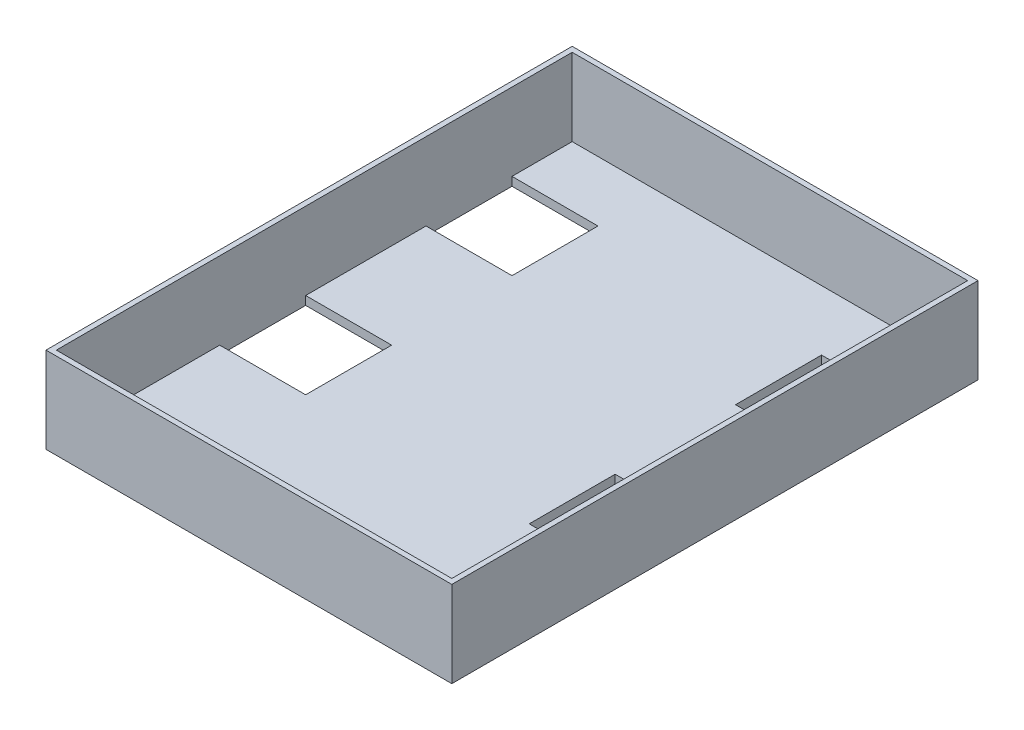
ISO-10303-21;
HEADER;
FILE_DESCRIPTION(('STEP AP214'),'2;1');
FILE_NAME('part.step','',(''),(''),'','','');
FILE_SCHEMA(('AUTOMOTIVE_DESIGN { 1 0 10303 214 1 1 1 1 }'));
ENDSEC;
DATA;
#1=APPLICATION_CONTEXT('core data for automotive mechanical design processes');
#2=APPLICATION_PROTOCOL_DEFINITION('international standard','automotive_design',2000,#1);
#3=PRODUCT_CONTEXT('',#1,'mechanical');
#4=PRODUCT('Part','Part','',(#3));
#5=PRODUCT_RELATED_PRODUCT_CATEGORY('part','',(#4));
#6=PRODUCT_DEFINITION_FORMATION('','',#4);
#7=PRODUCT_DEFINITION_CONTEXT('part definition',#1,'design');
#8=PRODUCT_DEFINITION('design','',#6,#7);
#9=PRODUCT_DEFINITION_SHAPE('','',#8);
#10=(LENGTH_UNIT() NAMED_UNIT(*) SI_UNIT(.MILLI.,.METRE.));
#11=(NAMED_UNIT(*) PLANE_ANGLE_UNIT() SI_UNIT($,.RADIAN.));
#12=(NAMED_UNIT(*) SI_UNIT($,.STERADIAN.) SOLID_ANGLE_UNIT());
#13=UNCERTAINTY_MEASURE_WITH_UNIT(LENGTH_MEASURE(1.E-05),#10,'distance_accuracy_value','');
#14=(GEOMETRIC_REPRESENTATION_CONTEXT(3) GLOBAL_UNCERTAINTY_ASSIGNED_CONTEXT((#13)) GLOBAL_UNIT_ASSIGNED_CONTEXT((#10,
#11,#12)) REPRESENTATION_CONTEXT('',''));
#15=CARTESIAN_POINT('',(0.,0.,0.));
#16=DIRECTION('',(0.,0.,1.));
#17=DIRECTION('',(1.,0.,0.));
#18=AXIS2_PLACEMENT_3D('',#15,#16,#17);
#19=CARTESIAN_POINT('',(-115.,5.,-115.));
#20=DIRECTION('',(0.,0.,-1.));
#21=DIRECTION('',(-1.,0.,0.));
#22=AXIS2_PLACEMENT_3D('',#19,#20,#21);
#23=PLANE('',#22);
#24=DIRECTION('',(1.,0.,0.));
#25=VECTOR('',#24,1.);
#26=CARTESIAN_POINT('',(-115.,0.,-115.));
#27=LINE('',#26,#25);
#28=CARTESIAN_POINT('',(-115.,0.,-115.));
#29=VERTEX_POINT('',#28);
#30=CARTESIAN_POINT('',(-65.,0.,-115.));
#31=VERTEX_POINT('',#30);
#32=EDGE_CURVE('E194',#29,#31,#27,.T.);
#33=ORIENTED_EDGE('',*,*,#32,.T.);
#34=DIRECTION('',(0.,-1.,0.));
#35=VECTOR('',#34,1.);
#36=CARTESIAN_POINT('',(-65.,5.,-115.));
#37=LINE('',#36,#35);
#38=CARTESIAN_POINT('',(-65.,5.,-115.));
#39=VERTEX_POINT('',#38);
#40=EDGE_CURVE('E48',#39,#31,#37,.T.);
#41=ORIENTED_EDGE('',*,*,#40,.F.);
#42=DIRECTION('',(1.,0.,0.));
#43=VECTOR('',#42,1.);
#44=CARTESIAN_POINT('',(-115.,5.,-115.));
#45=LINE('',#44,#43);
#46=CARTESIAN_POINT('',(-115.,5.,-115.));
#47=VERTEX_POINT('',#46);
#48=EDGE_CURVE('E116',#47,#39,#45,.T.);
#49=ORIENTED_EDGE('',*,*,#48,.F.);
#50=DIRECTION('',(0.,-1.,0.));
#51=VECTOR('',#50,1.);
#52=CARTESIAN_POINT('',(-115.,5.,-115.));
#53=LINE('',#52,#51);
#54=EDGE_CURVE('E11',#47,#29,#53,.T.);
#55=ORIENTED_EDGE('',*,*,#54,.T.);
#56=EDGE_LOOP('',(#33,#41,#49,#55));
#57=FACE_BOUND('',#56,.T.);
#58=ADVANCED_FACE('F39',(#57),#23,.F.);
#59=CARTESIAN_POINT('',(-65.,5.,-115.));
#60=DIRECTION('',(1.,0.,0.));
#61=DIRECTION('',(0.,0.,-1.));
#62=AXIS2_PLACEMENT_3D('',#59,#60,#61);
#63=PLANE('',#62);
#64=DIRECTION('',(0.,0.,1.));
#65=VECTOR('',#64,1.);
#66=CARTESIAN_POINT('',(-65.,0.,-115.));
#67=LINE('',#66,#65);
#68=CARTESIAN_POINT('',(-65.,0.,-65.));
#69=VERTEX_POINT('',#68);
#70=EDGE_CURVE('E197',#31,#69,#67,.T.);
#71=ORIENTED_EDGE('',*,*,#70,.T.);
#72=DIRECTION('',(0.,-1.,0.));
#73=VECTOR('',#72,1.);
#74=CARTESIAN_POINT('',(-65.,5.,-65.));
#75=LINE('',#74,#73);
#76=CARTESIAN_POINT('',(-65.,5.,-65.));
#77=VERTEX_POINT('',#76);
#78=EDGE_CURVE('E275',#77,#69,#75,.T.);
#79=ORIENTED_EDGE('',*,*,#78,.F.);
#80=DIRECTION('',(0.,0.,1.));
#81=VECTOR('',#80,1.);
#82=CARTESIAN_POINT('',(-65.,5.,-115.));
#83=LINE('',#82,#81);
#84=EDGE_CURVE('E285',#39,#77,#83,.T.);
#85=ORIENTED_EDGE('',*,*,#84,.F.);
#86=ORIENTED_EDGE('',*,*,#40,.T.);
#87=EDGE_LOOP('',(#71,#79,#85,#86));
#88=FACE_BOUND('',#87,.T.);
#89=ADVANCED_FACE('F283',(#88),#63,.F.);
#90=CARTESIAN_POINT('',(-65.,5.,-65.));
#91=DIRECTION('',(0.,0.,1.));
#92=DIRECTION('',(1.,0.,0.));
#93=AXIS2_PLACEMENT_3D('',#90,#91,#92);
#94=PLANE('',#93);
#95=DIRECTION('',(-1.,0.,0.));
#96=VECTOR('',#95,1.);
#97=CARTESIAN_POINT('',(-65.,0.,-65.));
#98=LINE('',#97,#96);
#99=CARTESIAN_POINT('',(-115.,0.,-65.));
#100=VERTEX_POINT('',#99);
#101=EDGE_CURVE('E201',#69,#100,#98,.T.);
#102=ORIENTED_EDGE('',*,*,#101,.T.);
#103=DIRECTION('',(0.,-1.,0.));
#104=VECTOR('',#103,1.);
#105=CARTESIAN_POINT('',(-115.,5.,-65.));
#106=LINE('',#105,#104);
#107=CARTESIAN_POINT('',(-115.,5.,-65.));
#108=VERTEX_POINT('',#107);
#109=EDGE_CURVE('E271',#108,#100,#106,.T.);
#110=ORIENTED_EDGE('',*,*,#109,.F.);
#111=DIRECTION('',(-1.,0.,0.));
#112=VECTOR('',#111,1.);
#113=CARTESIAN_POINT('',(-65.,5.,-65.));
#114=LINE('',#113,#112);
#115=EDGE_CURVE('E307',#77,#108,#114,.T.);
#116=ORIENTED_EDGE('',*,*,#115,.F.);
#117=ORIENTED_EDGE('',*,*,#78,.T.);
#118=EDGE_LOOP('',(#102,#110,#116,#117));
#119=FACE_BOUND('',#118,.T.);
#120=ADVANCED_FACE('F295',(#119),#94,.F.);
#121=CARTESIAN_POINT('',(-115.,5.,4.99999999999997));
#122=DIRECTION('',(0.,0.,-1.));
#123=DIRECTION('',(-1.,0.,0.));
#124=AXIS2_PLACEMENT_3D('',#121,#122,#123);
#125=PLANE('',#124);
#126=DIRECTION('',(1.,0.,0.));
#127=VECTOR('',#126,1.);
#128=CARTESIAN_POINT('',(-115.,0.,4.99999999999997));
#129=LINE('',#128,#127);
#130=CARTESIAN_POINT('',(-115.,0.,4.99999999999998));
#131=VERTEX_POINT('',#130);
#132=CARTESIAN_POINT('',(-65.,0.,4.99999999999997));
#133=VERTEX_POINT('',#132);
#134=EDGE_CURVE('E204',#131,#133,#129,.T.);
#135=ORIENTED_EDGE('',*,*,#134,.T.);
#136=DIRECTION('',(0.,-1.,0.));
#137=VECTOR('',#136,1.);
#138=CARTESIAN_POINT('',(-65.,5.,4.99999999999997));
#139=LINE('',#138,#137);
#140=CARTESIAN_POINT('',(-65.,5.,4.99999999999997));
#141=VERTEX_POINT('',#140);
#142=EDGE_CURVE('E263',#141,#133,#139,.T.);
#143=ORIENTED_EDGE('',*,*,#142,.F.);
#144=DIRECTION('',(1.,0.,0.));
#145=VECTOR('',#144,1.);
#146=CARTESIAN_POINT('',(-115.,5.,4.99999999999997));
#147=LINE('',#146,#145);
#148=CARTESIAN_POINT('',(-115.,5.,4.99999999999997));
#149=VERTEX_POINT('',#148);
#150=EDGE_CURVE('E306',#149,#141,#147,.T.);
#151=ORIENTED_EDGE('',*,*,#150,.F.);
#152=DIRECTION('',(0.,-1.,0.));
#153=VECTOR('',#152,1.);
#154=CARTESIAN_POINT('',(-115.,5.,4.99999999999997));
#155=LINE('',#154,#153);
#156=EDGE_CURVE('E267',#149,#131,#155,.T.);
#157=ORIENTED_EDGE('',*,*,#156,.T.);
#158=EDGE_LOOP('',(#135,#143,#151,#157));
#159=FACE_BOUND('',#158,.T.);
#160=ADVANCED_FACE('F443',(#159),#125,.F.);
#161=CARTESIAN_POINT('',(-65.,5.,4.99999999999997));
#162=DIRECTION('',(1.,0.,0.));
#163=DIRECTION('',(0.,0.,-1.));
#164=AXIS2_PLACEMENT_3D('',#161,#162,#163);
#165=PLANE('',#164);
#166=DIRECTION('',(0.,0.,1.));
#167=VECTOR('',#166,1.);
#168=CARTESIAN_POINT('',(-65.,0.,4.99999999999997));
#169=LINE('',#168,#167);
#170=CARTESIAN_POINT('',(-65.,0.,55.));
#171=VERTEX_POINT('',#170);
#172=EDGE_CURVE('E207',#133,#171,#169,.T.);
#173=ORIENTED_EDGE('',*,*,#172,.T.);
#174=DIRECTION('',(0.,-1.,0.));
#175=VECTOR('',#174,1.);
#176=CARTESIAN_POINT('',(-65.,5.,55.));
#177=LINE('',#176,#175);
#178=CARTESIAN_POINT('',(-65.,5.,55.));
#179=VERTEX_POINT('',#178);
#180=EDGE_CURVE('E259',#179,#171,#177,.T.);
#181=ORIENTED_EDGE('',*,*,#180,.F.);
#182=DIRECTION('',(0.,0.,1.));
#183=VECTOR('',#182,1.);
#184=CARTESIAN_POINT('',(-65.,5.,4.99999999999997));
#185=LINE('',#184,#183);
#186=EDGE_CURVE('E311',#141,#179,#185,.T.);
#187=ORIENTED_EDGE('',*,*,#186,.F.);
#188=ORIENTED_EDGE('',*,*,#142,.T.);
#189=EDGE_LOOP('',(#173,#181,#187,#188));
#190=FACE_BOUND('',#189,.T.);
#191=ADVANCED_FACE('F448',(#190),#165,.F.);
#192=CARTESIAN_POINT('',(-115.,5.,55.));
#193=DIRECTION('',(0.,0.,1.));
#194=DIRECTION('',(1.,0.,0.));
#195=AXIS2_PLACEMENT_3D('',#192,#193,#194);
#196=PLANE('',#195);
#197=DIRECTION('',(-1.,0.,0.));
#198=VECTOR('',#197,1.);
#199=CARTESIAN_POINT('',(-115.,0.,55.));
#200=LINE('',#199,#198);
#201=CARTESIAN_POINT('',(-115.,0.,55.));
#202=VERTEX_POINT('',#201);
#203=EDGE_CURVE('E210',#171,#202,#200,.T.);
#204=ORIENTED_EDGE('',*,*,#203,.T.);
#205=DIRECTION('',(0.,-1.,0.));
#206=VECTOR('',#205,1.);
#207=CARTESIAN_POINT('',(-115.,5.,55.));
#208=LINE('',#207,#206);
#209=CARTESIAN_POINT('',(-115.,5.,55.));
#210=VERTEX_POINT('',#209);
#211=EDGE_CURVE('E255',#210,#202,#208,.T.);
#212=ORIENTED_EDGE('',*,*,#211,.F.);
#213=DIRECTION('',(-1.,0.,0.));
#214=VECTOR('',#213,1.);
#215=CARTESIAN_POINT('',(-115.,5.,55.));
#216=LINE('',#215,#214);
#217=EDGE_CURVE('E318',#179,#210,#216,.T.);
#218=ORIENTED_EDGE('',*,*,#217,.F.);
#219=ORIENTED_EDGE('',*,*,#180,.T.);
#220=EDGE_LOOP('',(#204,#212,#218,#219));
#221=FACE_BOUND('',#220,.T.);
#222=ADVANCED_FACE('F452',(#221),#196,.F.);
#223=CARTESIAN_POINT('',(115.,5.,55.));
#224=DIRECTION('',(0.,0.,1.));
#225=DIRECTION('',(1.,0.,0.));
#226=AXIS2_PLACEMENT_3D('',#223,#224,#225);
#227=PLANE('',#226);
#228=DIRECTION('',(-1.,0.,0.));
#229=VECTOR('',#228,1.);
#230=CARTESIAN_POINT('',(115.,0.,55.));
#231=LINE('',#230,#229);
#232=CARTESIAN_POINT('',(115.,0.,55.));
#233=VERTEX_POINT('',#232);
#234=CARTESIAN_POINT('',(64.9999999999999,0.,55.));
#235=VERTEX_POINT('',#234);
#236=EDGE_CURVE('E213',#233,#235,#231,.T.);
#237=ORIENTED_EDGE('',*,*,#236,.T.);
#238=DIRECTION('',(0.,-1.,0.));
#239=VECTOR('',#238,1.);
#240=CARTESIAN_POINT('',(64.9999999999999,5.,55.));
#241=LINE('',#240,#239);
#242=CARTESIAN_POINT('',(64.9999999999999,5.,55.));
#243=VERTEX_POINT('',#242);
#244=EDGE_CURVE('E247',#243,#235,#241,.T.);
#245=ORIENTED_EDGE('',*,*,#244,.F.);
#246=DIRECTION('',(-1.,0.,0.));
#247=VECTOR('',#246,1.);
#248=CARTESIAN_POINT('',(115.,5.,55.));
#249=LINE('',#248,#247);
#250=CARTESIAN_POINT('',(115.,5.,55.));
#251=VERTEX_POINT('',#250);
#252=EDGE_CURVE('E330',#251,#243,#249,.T.);
#253=ORIENTED_EDGE('',*,*,#252,.F.);
#254=DIRECTION('',(0.,-1.,0.));
#255=VECTOR('',#254,1.);
#256=CARTESIAN_POINT('',(115.,5.,55.));
#257=LINE('',#256,#255);
#258=EDGE_CURVE('E251',#251,#233,#257,.T.);
#259=ORIENTED_EDGE('',*,*,#258,.T.);
#260=EDGE_LOOP('',(#237,#245,#253,#259));
#261=FACE_BOUND('',#260,.T.);
#262=ADVANCED_FACE('F456',(#261),#227,.F.);
#263=CARTESIAN_POINT('',(64.9999999999999,5.,4.99999999999997));
#264=DIRECTION('',(-1.,0.,0.));
#265=DIRECTION('',(0.,0.,1.));
#266=AXIS2_PLACEMENT_3D('',#263,#264,#265);
#267=PLANE('',#266);
#268=DIRECTION('',(0.,0.,-1.));
#269=VECTOR('',#268,1.);
#270=CARTESIAN_POINT('',(64.9999999999999,0.,4.99999999999997));
#271=LINE('',#270,#269);
#272=CARTESIAN_POINT('',(64.9999999999999,0.,4.99999999999997));
#273=VERTEX_POINT('',#272);
#274=EDGE_CURVE('E216',#235,#273,#271,.T.);
#275=ORIENTED_EDGE('',*,*,#274,.T.);
#276=DIRECTION('',(0.,-1.,0.));
#277=VECTOR('',#276,1.);
#278=CARTESIAN_POINT('',(64.9999999999999,5.,4.99999999999997));
#279=LINE('',#278,#277);
#280=CARTESIAN_POINT('',(64.9999999999999,5.,4.99999999999997));
#281=VERTEX_POINT('',#280);
#282=EDGE_CURVE('E243',#281,#273,#279,.T.);
#283=ORIENTED_EDGE('',*,*,#282,.F.);
#284=DIRECTION('',(0.,0.,-1.));
#285=VECTOR('',#284,1.);
#286=CARTESIAN_POINT('',(64.9999999999999,5.,4.99999999999997));
#287=LINE('',#286,#285);
#288=EDGE_CURVE('E333',#243,#281,#287,.T.);
#289=ORIENTED_EDGE('',*,*,#288,.F.);
#290=ORIENTED_EDGE('',*,*,#244,.T.);
#291=EDGE_LOOP('',(#275,#283,#289,#290));
#292=FACE_BOUND('',#291,.T.);
#293=ADVANCED_FACE('F460',(#292),#267,.F.);
#294=CARTESIAN_POINT('',(115.,5.,4.99999999999997));
#295=DIRECTION('',(0.,0.,-1.));
#296=DIRECTION('',(-1.,0.,0.));
#297=AXIS2_PLACEMENT_3D('',#294,#295,#296);
#298=PLANE('',#297);
#299=DIRECTION('',(1.,0.,0.));
#300=VECTOR('',#299,1.);
#301=CARTESIAN_POINT('',(115.,0.,4.99999999999997));
#302=LINE('',#301,#300);
#303=CARTESIAN_POINT('',(115.,0.,4.99999999999997));
#304=VERTEX_POINT('',#303);
#305=EDGE_CURVE('E219',#273,#304,#302,.T.);
#306=ORIENTED_EDGE('',*,*,#305,.T.);
#307=DIRECTION('',(0.,-1.,0.));
#308=VECTOR('',#307,1.);
#309=CARTESIAN_POINT('',(115.,5.,4.99999999999997));
#310=LINE('',#309,#308);
#311=CARTESIAN_POINT('',(115.,5.,4.99999999999997));
#312=VERTEX_POINT('',#311);
#313=EDGE_CURVE('E239',#312,#304,#310,.T.);
#314=ORIENTED_EDGE('',*,*,#313,.F.);
#315=DIRECTION('',(1.,0.,0.));
#316=VECTOR('',#315,1.);
#317=CARTESIAN_POINT('',(115.,5.,4.99999999999997));
#318=LINE('',#317,#316);
#319=EDGE_CURVE('E336',#281,#312,#318,.T.);
#320=ORIENTED_EDGE('',*,*,#319,.F.);
#321=ORIENTED_EDGE('',*,*,#282,.T.);
#322=EDGE_LOOP('',(#306,#314,#320,#321));
#323=FACE_BOUND('',#322,.T.);
#324=ADVANCED_FACE('F464',(#323),#298,.F.);
#325=CARTESIAN_POINT('',(65.,5.,-65.));
#326=DIRECTION('',(0.,0.,1.));
#327=DIRECTION('',(1.,0.,0.));
#328=AXIS2_PLACEMENT_3D('',#325,#326,#327);
#329=PLANE('',#328);
#330=DIRECTION('',(-1.,0.,0.));
#331=VECTOR('',#330,1.);
#332=CARTESIAN_POINT('',(65.,0.,-65.));
#333=LINE('',#332,#331);
#334=CARTESIAN_POINT('',(115.,0.,-65.));
#335=VERTEX_POINT('',#334);
#336=CARTESIAN_POINT('',(65.,0.,-65.));
#337=VERTEX_POINT('',#336);
#338=EDGE_CURVE('E222',#335,#337,#333,.T.);
#339=ORIENTED_EDGE('',*,*,#338,.T.);
#340=DIRECTION('',(0.,-1.,0.));
#341=VECTOR('',#340,1.);
#342=CARTESIAN_POINT('',(65.,5.,-65.));
#343=LINE('',#342,#341);
#344=CARTESIAN_POINT('',(65.,5.,-65.));
#345=VERTEX_POINT('',#344);
#346=EDGE_CURVE('E232',#345,#337,#343,.T.);
#347=ORIENTED_EDGE('',*,*,#346,.F.);
#348=DIRECTION('',(-1.,0.,0.));
#349=VECTOR('',#348,1.);
#350=CARTESIAN_POINT('',(65.,5.,-65.));
#351=LINE('',#350,#349);
#352=CARTESIAN_POINT('',(115.,5.,-65.));
#353=VERTEX_POINT('',#352);
#354=EDGE_CURVE('E342',#353,#345,#351,.T.);
#355=ORIENTED_EDGE('',*,*,#354,.F.);
#356=DIRECTION('',(0.,-1.,0.));
#357=VECTOR('',#356,1.);
#358=CARTESIAN_POINT('',(115.,5.,-65.));
#359=LINE('',#358,#357);
#360=EDGE_CURVE('E235',#353,#335,#359,.T.);
#361=ORIENTED_EDGE('',*,*,#360,.T.);
#362=EDGE_LOOP('',(#339,#347,#355,#361));
#363=FACE_BOUND('',#362,.T.);
#364=ADVANCED_FACE('F350',(#363),#329,.F.);
#365=CARTESIAN_POINT('',(65.,5.,-115.));
#366=DIRECTION('',(-1.,0.,0.));
#367=DIRECTION('',(0.,0.,1.));
#368=AXIS2_PLACEMENT_3D('',#365,#366,#367);
#369=PLANE('',#368);
#370=DIRECTION('',(0.,0.,-1.));
#371=VECTOR('',#370,1.);
#372=CARTESIAN_POINT('',(65.,0.,-115.));
#373=LINE('',#372,#371);
#374=CARTESIAN_POINT('',(65.,0.,-115.));
#375=VERTEX_POINT('',#374);
#376=EDGE_CURVE('E101',#337,#375,#373,.T.);
#377=ORIENTED_EDGE('',*,*,#376,.T.);
#378=DIRECTION('',(0.,-1.,0.));
#379=VECTOR('',#378,1.);
#380=CARTESIAN_POINT('',(65.,5.,-115.));
#381=LINE('',#380,#379);
#382=CARTESIAN_POINT('',(65.,5.,-115.));
#383=VERTEX_POINT('',#382);
#384=EDGE_CURVE('E181',#383,#375,#381,.T.);
#385=ORIENTED_EDGE('',*,*,#384,.F.);
#386=DIRECTION('',(0.,0.,-1.));
#387=VECTOR('',#386,1.);
#388=CARTESIAN_POINT('',(65.,5.,-115.));
#389=LINE('',#388,#387);
#390=EDGE_CURVE('E172',#345,#383,#389,.T.);
#391=ORIENTED_EDGE('',*,*,#390,.F.);
#392=ORIENTED_EDGE('',*,*,#346,.T.);
#393=EDGE_LOOP('',(#377,#385,#391,#392));
#394=FACE_BOUND('',#393,.T.);
#395=ADVANCED_FACE('F352',(#394),#369,.F.);
#396=CARTESIAN_POINT('',(115.,5.,-115.));
#397=DIRECTION('',(0.,0.,-1.));
#398=DIRECTION('',(-1.,0.,0.));
#399=AXIS2_PLACEMENT_3D('',#396,#397,#398);
#400=PLANE('',#399);
#401=DIRECTION('',(1.,0.,0.));
#402=VECTOR('',#401,1.);
#403=CARTESIAN_POINT('',(115.,0.,-115.));
#404=LINE('',#403,#402);
#405=CARTESIAN_POINT('',(115.,0.,-115.));
#406=VERTEX_POINT('',#405);
#407=EDGE_CURVE('E108',#375,#406,#404,.T.);
#408=ORIENTED_EDGE('',*,*,#407,.T.);
#409=DIRECTION('',(0.,-1.,0.));
#410=VECTOR('',#409,1.);
#411=CARTESIAN_POINT('',(115.,5.,-115.));
#412=LINE('',#411,#410);
#413=CARTESIAN_POINT('',(115.,5.,-115.));
#414=VERTEX_POINT('',#413);
#415=EDGE_CURVE('E175',#414,#406,#412,.T.);
#416=ORIENTED_EDGE('',*,*,#415,.F.);
#417=DIRECTION('',(1.,0.,0.));
#418=VECTOR('',#417,1.);
#419=CARTESIAN_POINT('',(115.,5.,-115.));
#420=LINE('',#419,#418);
#421=EDGE_CURVE('E167',#383,#414,#420,.T.);
#422=ORIENTED_EDGE('',*,*,#421,.F.);
#423=ORIENTED_EDGE('',*,*,#384,.T.);
#424=EDGE_LOOP('',(#408,#416,#422,#423));
#425=FACE_BOUND('',#424,.T.);
#426=ADVANCED_FACE('F176',(#425),#400,.F.);
#427=CARTESIAN_POINT('',(0.,5.,0.));
#428=DIRECTION('',(0.,1.,0.));
#429=DIRECTION('',(0.,0.,1.));
#430=AXIS2_PLACEMENT_3D('',#427,#428,#429);
#431=PLANE('',#430);
#432=DIRECTION('',(0.,0.,1.));
#433=VECTOR('',#432,1.);
#434=CARTESIAN_POINT('',(-115.,5.,-150.));
#435=LINE('',#434,#433);
#436=CARTESIAN_POINT('',(-115.,5.,-150.));
#437=VERTEX_POINT('',#436);
#438=EDGE_CURVE('E228',#437,#47,#435,.T.);
#439=ORIENTED_EDGE('',*,*,#438,.T.);
#440=ORIENTED_EDGE('',*,*,#48,.T.);
#441=ORIENTED_EDGE('',*,*,#84,.T.);
#442=ORIENTED_EDGE('',*,*,#115,.T.);
#443=DIRECTION('',(0.,0.,1.));
#444=VECTOR('',#443,1.);
#445=CARTESIAN_POINT('',(-115.,5.,-65.));
#446=LINE('',#445,#444);
#447=EDGE_CURVE('E302',#108,#149,#446,.T.);
#448=ORIENTED_EDGE('',*,*,#447,.T.);
#449=ORIENTED_EDGE('',*,*,#150,.T.);
#450=ORIENTED_EDGE('',*,*,#186,.T.);
#451=ORIENTED_EDGE('',*,*,#217,.T.);
#452=DIRECTION('',(0.,0.,1.));
#453=VECTOR('',#452,1.);
#454=CARTESIAN_POINT('',(-115.,5.,55.));
#455=LINE('',#454,#453);
#456=CARTESIAN_POINT('',(-115.,5.,150.));
#457=VERTEX_POINT('',#456);
#458=EDGE_CURVE('E321',#210,#457,#455,.T.);
#459=ORIENTED_EDGE('',*,*,#458,.T.);
#460=DIRECTION('',(1.,0.,0.));
#461=VECTOR('',#460,1.);
#462=CARTESIAN_POINT('',(-115.,5.,150.));
#463=LINE('',#462,#461);
#464=CARTESIAN_POINT('',(115.,5.,150.));
#465=VERTEX_POINT('',#464);
#466=EDGE_CURVE('E324',#457,#465,#463,.T.);
#467=ORIENTED_EDGE('',*,*,#466,.T.);
#468=DIRECTION('',(0.,0.,-1.));
#469=VECTOR('',#468,1.);
#470=CARTESIAN_POINT('',(115.,5.,55.));
#471=LINE('',#470,#469);
#472=EDGE_CURVE('E327',#465,#251,#471,.T.);
#473=ORIENTED_EDGE('',*,*,#472,.T.);
#474=ORIENTED_EDGE('',*,*,#252,.T.);
#475=ORIENTED_EDGE('',*,*,#288,.T.);
#476=ORIENTED_EDGE('',*,*,#319,.T.);
#477=DIRECTION('',(0.,0.,-1.));
#478=VECTOR('',#477,1.);
#479=CARTESIAN_POINT('',(115.,5.,-65.));
#480=LINE('',#479,#478);
#481=EDGE_CURVE('E339',#312,#353,#480,.T.);
#482=ORIENTED_EDGE('',*,*,#481,.T.);
#483=ORIENTED_EDGE('',*,*,#354,.T.);
#484=ORIENTED_EDGE('',*,*,#390,.T.);
#485=ORIENTED_EDGE('',*,*,#421,.T.);
#486=DIRECTION('',(0.,0.,-1.));
#487=VECTOR('',#486,1.);
#488=CARTESIAN_POINT('',(115.,5.,-150.));
#489=LINE('',#488,#487);
#490=CARTESIAN_POINT('',(115.,5.,-150.));
#491=VERTEX_POINT('',#490);
#492=EDGE_CURVE('E170',#414,#491,#489,.T.);
#493=ORIENTED_EDGE('',*,*,#492,.T.);
#494=DIRECTION('',(-1.,0.,0.));
#495=VECTOR('',#494,1.);
#496=CARTESIAN_POINT('',(-115.,5.,-150.));
#497=LINE('',#496,#495);
#498=EDGE_CURVE('E56',#491,#437,#497,.T.);
#499=ORIENTED_EDGE('',*,*,#498,.T.);
#500=EDGE_LOOP('',(#439,#440,#441,#442,#448,#449,#450,#451,#459,#467,#473,#474,#475,#476,#482,
#483,#484,#485,#493,#499));
#501=FACE_BOUND('',#500,.T.);
#502=ADVANCED_FACE('F168',(#501),#431,.T.);
#503=CARTESIAN_POINT('',(0.,0.,0.));
#504=DIRECTION('',(0.,1.,0.));
#505=DIRECTION('',(0.,0.,1.));
#506=AXIS2_PLACEMENT_3D('',#503,#504,#505);
#507=PLANE('',#506);
#508=ORIENTED_EDGE('',*,*,#134,.F.);
#509=DIRECTION('',(0.,0.,1.));
#510=VECTOR('',#509,1.);
#511=CARTESIAN_POINT('',(-115.,0.,-150.));
#512=LINE('',#511,#510);
#513=EDGE_CURVE('E363',#131,#202,#512,.T.);
#514=ORIENTED_EDGE('',*,*,#513,.T.);
#515=ORIENTED_EDGE('',*,*,#203,.F.);
#516=ORIENTED_EDGE('',*,*,#172,.F.);
#517=EDGE_LOOP('',(#508,#514,#515,#516));
#518=FACE_BOUND('',#517,.T.);
#519=ORIENTED_EDGE('',*,*,#32,.F.);
#520=EDGE_CURVE('E292',#29,#100,#512,.T.);
#521=ORIENTED_EDGE('',*,*,#520,.T.);
#522=ORIENTED_EDGE('',*,*,#101,.F.);
#523=ORIENTED_EDGE('',*,*,#70,.F.);
#524=EDGE_LOOP('',(#519,#521,#522,#523));
#525=FACE_BOUND('',#524,.T.);
#526=ORIENTED_EDGE('',*,*,#338,.F.);
#527=DIRECTION('',(0.,0.,-1.));
#528=VECTOR('',#527,1.);
#529=CARTESIAN_POINT('',(115.,0.,-150.));
#530=LINE('',#529,#528);
#531=EDGE_CURVE('E354',#335,#406,#530,.T.);
#532=ORIENTED_EDGE('',*,*,#531,.T.);
#533=ORIENTED_EDGE('',*,*,#407,.F.);
#534=ORIENTED_EDGE('',*,*,#376,.F.);
#535=EDGE_LOOP('',(#526,#532,#533,#534));
#536=FACE_BOUND('',#535,.T.);
#537=ORIENTED_EDGE('',*,*,#236,.F.);
#538=EDGE_CURVE('E357',#233,#304,#530,.T.);
#539=ORIENTED_EDGE('',*,*,#538,.T.);
#540=ORIENTED_EDGE('',*,*,#305,.F.);
#541=ORIENTED_EDGE('',*,*,#274,.F.);
#542=EDGE_LOOP('',(#537,#539,#540,#541));
#543=FACE_BOUND('',#542,.T.);
#544=DIRECTION('',(-1.,0.,0.));
#545=VECTOR('',#544,1.);
#546=CARTESIAN_POINT('',(-118.,0.,-153.));
#547=LINE('',#546,#545);
#548=CARTESIAN_POINT('',(118.,0.,-153.));
#549=VERTEX_POINT('',#548);
#550=CARTESIAN_POINT('',(-118.,0.,-153.));
#551=VERTEX_POINT('',#550);
#552=EDGE_CURVE('E382',#549,#551,#547,.T.);
#553=ORIENTED_EDGE('',*,*,#552,.F.);
#554=DIRECTION('',(0.,0.,-1.));
#555=VECTOR('',#554,1.);
#556=CARTESIAN_POINT('',(118.,0.,-153.));
#557=LINE('',#556,#555);
#558=CARTESIAN_POINT('',(118.,0.,153.));
#559=VERTEX_POINT('',#558);
#560=EDGE_CURVE('E388',#559,#549,#557,.T.);
#561=ORIENTED_EDGE('',*,*,#560,.F.);
#562=DIRECTION('',(1.,0.,0.));
#563=VECTOR('',#562,1.);
#564=CARTESIAN_POINT('',(-118.,0.,153.));
#565=LINE('',#564,#563);
#566=CARTESIAN_POINT('',(-118.,0.,153.));
#567=VERTEX_POINT('',#566);
#568=EDGE_CURVE('E408',#567,#559,#565,.T.);
#569=ORIENTED_EDGE('',*,*,#568,.F.);
#570=DIRECTION('',(0.,0.,1.));
#571=VECTOR('',#570,1.);
#572=CARTESIAN_POINT('',(-118.,0.,-153.));
#573=LINE('',#572,#571);
#574=EDGE_CURVE('E404',#551,#567,#573,.T.);
#575=ORIENTED_EDGE('',*,*,#574,.F.);
#576=EDGE_LOOP('',(#553,#561,#569,#575));
#577=FACE_BOUND('',#576,.T.);
#578=ADVANCED_FACE('F288',(#518,#525,#536,#543,#577),#507,.F.);
#579=CARTESIAN_POINT('',(-115.,50.,-150.));
#580=DIRECTION('',(1.,0.,0.));
#581=DIRECTION('',(0.,0.,-1.));
#582=AXIS2_PLACEMENT_3D('',#579,#580,#581);
#583=PLANE('',#582);
#584=ORIENTED_EDGE('',*,*,#211,.T.);
#585=ORIENTED_EDGE('',*,*,#513,.F.);
#586=ORIENTED_EDGE('',*,*,#156,.F.);
#587=ORIENTED_EDGE('',*,*,#447,.F.);
#588=ORIENTED_EDGE('',*,*,#109,.T.);
#589=ORIENTED_EDGE('',*,*,#520,.F.);
#590=ORIENTED_EDGE('',*,*,#54,.F.);
#591=ORIENTED_EDGE('',*,*,#438,.F.);
#592=DIRECTION('',(0.,-1.,0.));
#593=VECTOR('',#592,1.);
#594=CARTESIAN_POINT('',(-115.,50.,-150.));
#595=LINE('',#594,#593);
#596=CARTESIAN_POINT('',(-115.,50.,-150.));
#597=VERTEX_POINT('',#596);
#598=EDGE_CURVE('E367',#597,#437,#595,.T.);
#599=ORIENTED_EDGE('',*,*,#598,.F.);
#600=DIRECTION('',(0.,0.,1.));
#601=VECTOR('',#600,1.);
#602=CARTESIAN_POINT('',(-115.,50.,-150.));
#603=LINE('',#602,#601);
#604=CARTESIAN_POINT('',(-115.,50.,150.));
#605=VERTEX_POINT('',#604);
#606=EDGE_CURVE('E362',#597,#605,#603,.T.);
#607=ORIENTED_EDGE('',*,*,#606,.T.);
#608=DIRECTION('',(0.,-1.,0.));
#609=VECTOR('',#608,1.);
#610=CARTESIAN_POINT('',(-115.,50.,150.));
#611=LINE('',#610,#609);
#612=EDGE_CURVE('E378',#605,#457,#611,.T.);
#613=ORIENTED_EDGE('',*,*,#612,.T.);
#614=ORIENTED_EDGE('',*,*,#458,.F.);
#615=EDGE_LOOP('',(#584,#585,#586,#587,#588,#589,#590,#591,#599,#607,#613,#614));
#616=FACE_BOUND('',#615,.T.);
#617=ADVANCED_FACE('F299',(#616),#583,.T.);
#618=CARTESIAN_POINT('',(115.,50.,-150.));
#619=DIRECTION('',(-1.,0.,0.));
#620=DIRECTION('',(0.,0.,1.));
#621=AXIS2_PLACEMENT_3D('',#618,#619,#620);
#622=PLANE('',#621);
#623=ORIENTED_EDGE('',*,*,#415,.T.);
#624=ORIENTED_EDGE('',*,*,#531,.F.);
#625=ORIENTED_EDGE('',*,*,#360,.F.);
#626=ORIENTED_EDGE('',*,*,#481,.F.);
#627=ORIENTED_EDGE('',*,*,#313,.T.);
#628=ORIENTED_EDGE('',*,*,#538,.F.);
#629=ORIENTED_EDGE('',*,*,#258,.F.);
#630=ORIENTED_EDGE('',*,*,#472,.F.);
#631=DIRECTION('',(0.,-1.,0.));
#632=VECTOR('',#631,1.);
#633=CARTESIAN_POINT('',(115.,50.,150.));
#634=LINE('',#633,#632);
#635=CARTESIAN_POINT('',(115.,50.,150.));
#636=VERTEX_POINT('',#635);
#637=EDGE_CURVE('E374',#636,#465,#634,.T.);
#638=ORIENTED_EDGE('',*,*,#637,.F.);
#639=DIRECTION('',(0.,0.,-1.));
#640=VECTOR('',#639,1.);
#641=CARTESIAN_POINT('',(115.,50.,-150.));
#642=LINE('',#641,#640);
#643=CARTESIAN_POINT('',(115.,50.,-150.));
#644=VERTEX_POINT('',#643);
#645=EDGE_CURVE('E532',#636,#644,#642,.T.);
#646=ORIENTED_EDGE('',*,*,#645,.T.);
#647=DIRECTION('',(0.,-1.,0.));
#648=VECTOR('',#647,1.);
#649=CARTESIAN_POINT('',(115.,50.,-150.));
#650=LINE('',#649,#648);
#651=EDGE_CURVE('E187',#644,#491,#650,.T.);
#652=ORIENTED_EDGE('',*,*,#651,.T.);
#653=ORIENTED_EDGE('',*,*,#492,.F.);
#654=EDGE_LOOP('',(#623,#624,#625,#626,#627,#628,#629,#630,#638,#646,#652,#653));
#655=FACE_BOUND('',#654,.T.);
#656=ADVANCED_FACE('F184',(#655),#622,.T.);
#657=CARTESIAN_POINT('',(0.,50.,0.));
#658=DIRECTION('',(0.,-1.,0.));
#659=DIRECTION('',(0.,0.,-1.));
#660=AXIS2_PLACEMENT_3D('',#657,#658,#659);
#661=PLANE('',#660);
#662=DIRECTION('',(-1.,0.,0.));
#663=VECTOR('',#662,1.);
#664=CARTESIAN_POINT('',(-118.,50.,-153.));
#665=LINE('',#664,#663);
#666=CARTESIAN_POINT('',(118.,50.,-153.));
#667=VERTEX_POINT('',#666);
#668=CARTESIAN_POINT('',(-118.,50.,-153.));
#669=VERTEX_POINT('',#668);
#670=EDGE_CURVE('E383',#667,#669,#665,.T.);
#671=ORIENTED_EDGE('',*,*,#670,.T.);
#672=DIRECTION('',(0.,0.,1.));
#673=VECTOR('',#672,1.);
#674=CARTESIAN_POINT('',(-118.,50.,-153.));
#675=LINE('',#674,#673);
#676=CARTESIAN_POINT('',(-118.,50.,153.));
#677=VERTEX_POINT('',#676);
#678=EDGE_CURVE('E387',#669,#677,#675,.T.);
#679=ORIENTED_EDGE('',*,*,#678,.T.);
#680=DIRECTION('',(1.,0.,0.));
#681=VECTOR('',#680,1.);
#682=CARTESIAN_POINT('',(-118.,50.,153.));
#683=LINE('',#682,#681);
#684=CARTESIAN_POINT('',(118.,50.,153.));
#685=VERTEX_POINT('',#684);
#686=EDGE_CURVE('E392',#677,#685,#683,.T.);
#687=ORIENTED_EDGE('',*,*,#686,.T.);
#688=DIRECTION('',(0.,0.,-1.));
#689=VECTOR('',#688,1.);
#690=CARTESIAN_POINT('',(118.,50.,-153.));
#691=LINE('',#690,#689);
#692=EDGE_CURVE('E396',#685,#667,#691,.T.);
#693=ORIENTED_EDGE('',*,*,#692,.T.);
#694=EDGE_LOOP('',(#671,#679,#687,#693));
#695=FACE_BOUND('',#694,.T.);
#696=ORIENTED_EDGE('',*,*,#606,.F.);
#697=DIRECTION('',(-1.,0.,0.));
#698=VECTOR('',#697,1.);
#699=CARTESIAN_POINT('',(-115.,50.,-150.));
#700=LINE('',#699,#698);
#701=EDGE_CURVE('E371',#644,#597,#700,.T.);
#702=ORIENTED_EDGE('',*,*,#701,.F.);
#703=ORIENTED_EDGE('',*,*,#645,.F.);
#704=DIRECTION('',(1.,0.,0.));
#705=VECTOR('',#704,1.);
#706=CARTESIAN_POINT('',(-115.,50.,150.));
#707=LINE('',#706,#705);
#708=EDGE_CURVE('E528',#605,#636,#707,.T.);
#709=ORIENTED_EDGE('',*,*,#708,.F.);
#710=EDGE_LOOP('',(#696,#702,#703,#709));
#711=FACE_BOUND('',#710,.T.);
#712=ADVANCED_FACE('F484',(#695,#711),#661,.F.);
#713=CARTESIAN_POINT('',(-118.,50.,-153.));
#714=DIRECTION('',(0.,0.,1.));
#715=DIRECTION('',(1.,0.,0.));
#716=AXIS2_PLACEMENT_3D('',#713,#714,#715);
#717=PLANE('',#716);
#718=ORIENTED_EDGE('',*,*,#552,.T.);
#719=DIRECTION('',(0.,-1.,0.));
#720=VECTOR('',#719,1.);
#721=CARTESIAN_POINT('',(-118.,50.,-153.));
#722=LINE('',#721,#720);
#723=EDGE_CURVE('E198',#669,#551,#722,.T.);
#724=ORIENTED_EDGE('',*,*,#723,.F.);
#725=ORIENTED_EDGE('',*,*,#670,.F.);
#726=DIRECTION('',(0.,-1.,0.));
#727=VECTOR('',#726,1.);
#728=CARTESIAN_POINT('',(118.,50.,-153.));
#729=LINE('',#728,#727);
#730=EDGE_CURVE('E400',#667,#549,#729,.T.);
#731=ORIENTED_EDGE('',*,*,#730,.T.);
#732=EDGE_LOOP('',(#718,#724,#725,#731));
#733=FACE_BOUND('',#732,.T.);
#734=ADVANCED_FACE('F480',(#733),#717,.F.);
#735=CARTESIAN_POINT('',(-118.,50.,-153.));
#736=DIRECTION('',(1.,0.,0.));
#737=DIRECTION('',(0.,0.,-1.));
#738=AXIS2_PLACEMENT_3D('',#735,#736,#737);
#739=PLANE('',#738);
#740=ORIENTED_EDGE('',*,*,#574,.T.);
#741=DIRECTION('',(0.,-1.,0.));
#742=VECTOR('',#741,1.);
#743=CARTESIAN_POINT('',(-118.,50.,153.));
#744=LINE('',#743,#742);
#745=EDGE_CURVE('E422',#677,#567,#744,.T.);
#746=ORIENTED_EDGE('',*,*,#745,.F.);
#747=ORIENTED_EDGE('',*,*,#678,.F.);
#748=ORIENTED_EDGE('',*,*,#723,.T.);
#749=EDGE_LOOP('',(#740,#746,#747,#748));
#750=FACE_BOUND('',#749,.T.);
#751=ADVANCED_FACE('F483',(#750),#739,.F.);
#752=CARTESIAN_POINT('',(-118.,50.,153.));
#753=DIRECTION('',(0.,0.,-1.));
#754=DIRECTION('',(-1.,0.,0.));
#755=AXIS2_PLACEMENT_3D('',#752,#753,#754);
#756=PLANE('',#755);
#757=ORIENTED_EDGE('',*,*,#568,.T.);
#758=DIRECTION('',(0.,-1.,0.));
#759=VECTOR('',#758,1.);
#760=CARTESIAN_POINT('',(118.,50.,153.));
#761=LINE('',#760,#759);
#762=EDGE_CURVE('E418',#685,#559,#761,.T.);
#763=ORIENTED_EDGE('',*,*,#762,.F.);
#764=ORIENTED_EDGE('',*,*,#686,.F.);
#765=ORIENTED_EDGE('',*,*,#745,.T.);
#766=EDGE_LOOP('',(#757,#763,#764,#765));
#767=FACE_BOUND('',#766,.T.);
#768=ADVANCED_FACE('F488',(#767),#756,.F.);
#769=CARTESIAN_POINT('',(118.,50.,-153.));
#770=DIRECTION('',(-1.,0.,0.));
#771=DIRECTION('',(0.,0.,1.));
#772=AXIS2_PLACEMENT_3D('',#769,#770,#771);
#773=PLANE('',#772);
#774=ORIENTED_EDGE('',*,*,#560,.T.);
#775=ORIENTED_EDGE('',*,*,#730,.F.);
#776=ORIENTED_EDGE('',*,*,#692,.F.);
#777=ORIENTED_EDGE('',*,*,#762,.T.);
#778=EDGE_LOOP('',(#774,#775,#776,#777));
#779=FACE_BOUND('',#778,.T.);
#780=ADVANCED_FACE('F492',(#779),#773,.F.);
#781=CARTESIAN_POINT('',(-115.,50.,150.));
#782=DIRECTION('',(0.,0.,-1.));
#783=DIRECTION('',(-1.,0.,0.));
#784=AXIS2_PLACEMENT_3D('',#781,#782,#783);
#785=PLANE('',#784);
#786=ORIENTED_EDGE('',*,*,#637,.T.);
#787=ORIENTED_EDGE('',*,*,#466,.F.);
#788=ORIENTED_EDGE('',*,*,#612,.F.);
#789=ORIENTED_EDGE('',*,*,#708,.T.);
#790=EDGE_LOOP('',(#786,#787,#788,#789));
#791=FACE_BOUND('',#790,.T.);
#792=ADVANCED_FACE('F496',(#791),#785,.T.);
#793=CARTESIAN_POINT('',(-115.,50.,-150.));
#794=DIRECTION('',(0.,0.,1.));
#795=DIRECTION('',(1.,0.,0.));
#796=AXIS2_PLACEMENT_3D('',#793,#794,#795);
#797=PLANE('',#796);
#798=ORIENTED_EDGE('',*,*,#598,.T.);
#799=ORIENTED_EDGE('',*,*,#498,.F.);
#800=ORIENTED_EDGE('',*,*,#651,.F.);
#801=ORIENTED_EDGE('',*,*,#701,.T.);
#802=EDGE_LOOP('',(#798,#799,#800,#801));
#803=FACE_BOUND('',#802,.T.);
#804=ADVANCED_FACE('F505',(#803),#797,.T.);
#805=CLOSED_SHELL('',(#58,#89,#120,#160,#191,#222,#262,#293,#324,#364,#395,#426,#502,#578,#617,
#656,#712,#734,#751,#768,#780,#792,#804));
#806=MANIFOLD_SOLID_BREP('B2',#805);
#807=ADVANCED_BREP_SHAPE_REPRESENTATION('',(#18,#806),#14);
#808=SHAPE_DEFINITION_REPRESENTATION(#9,#807);
ENDSEC;
END-ISO-10303-21;
